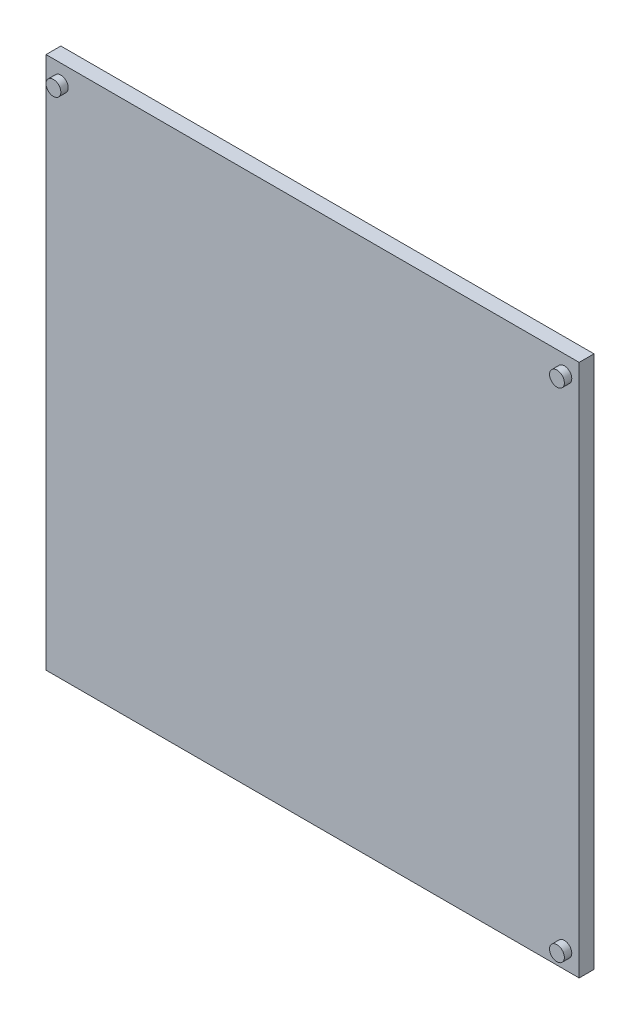
ISO-10303-21;
HEADER;
FILE_DESCRIPTION(('STEP AP214'),'2;1');
FILE_NAME('part.step','',(''),(''),'','','');
FILE_SCHEMA(('AUTOMOTIVE_DESIGN { 1 0 10303 214 1 1 1 1 }'));
ENDSEC;
DATA;
#1=APPLICATION_CONTEXT('core data for automotive mechanical design processes');
#2=APPLICATION_PROTOCOL_DEFINITION('international standard','automotive_design',2000,#1);
#3=PRODUCT_CONTEXT('',#1,'mechanical');
#4=PRODUCT('Part','Part','',(#3));
#5=PRODUCT_RELATED_PRODUCT_CATEGORY('part','',(#4));
#6=PRODUCT_DEFINITION_FORMATION('','',#4);
#7=PRODUCT_DEFINITION_CONTEXT('part definition',#1,'design');
#8=PRODUCT_DEFINITION('design','',#6,#7);
#9=PRODUCT_DEFINITION_SHAPE('','',#8);
#10=(LENGTH_UNIT() NAMED_UNIT(*) SI_UNIT(.MILLI.,.METRE.));
#11=(NAMED_UNIT(*) PLANE_ANGLE_UNIT() SI_UNIT($,.RADIAN.));
#12=(NAMED_UNIT(*) SI_UNIT($,.STERADIAN.) SOLID_ANGLE_UNIT());
#13=UNCERTAINTY_MEASURE_WITH_UNIT(LENGTH_MEASURE(1.E-05),#10,'distance_accuracy_value','');
#14=(GEOMETRIC_REPRESENTATION_CONTEXT(3) GLOBAL_UNCERTAINTY_ASSIGNED_CONTEXT((#13)) GLOBAL_UNIT_ASSIGNED_CONTEXT((#10,
#11,#12)) REPRESENTATION_CONTEXT('',''));
#15=CARTESIAN_POINT('',(0.,0.,0.));
#16=DIRECTION('',(0.,0.,1.));
#17=DIRECTION('',(1.,0.,0.));
#18=AXIS2_PLACEMENT_3D('',#15,#16,#17);
#19=CARTESIAN_POINT('',(45.,-45.,2.5));
#20=DIRECTION('',(-1.,0.,0.));
#21=DIRECTION('',(0.,0.,1.));
#22=AXIS2_PLACEMENT_3D('',#19,#20,#21);
#23=PLANE('',#22);
#24=DIRECTION('',(0.,1.,0.));
#25=VECTOR('',#24,1.);
#26=CARTESIAN_POINT('',(45.,-45.,0.));
#27=LINE('',#26,#25);
#28=CARTESIAN_POINT('',(45.,-45.,0.));
#29=VERTEX_POINT('',#28);
#30=CARTESIAN_POINT('',(45.,45.,0.));
#31=VERTEX_POINT('',#30);
#32=EDGE_CURVE('E112',#29,#31,#27,.T.);
#33=ORIENTED_EDGE('',*,*,#32,.T.);
#34=DIRECTION('',(0.,0.,-1.));
#35=VECTOR('',#34,1.);
#36=CARTESIAN_POINT('',(45.,45.,2.5));
#37=LINE('',#36,#35);
#38=CARTESIAN_POINT('',(45.,45.,2.5));
#39=VERTEX_POINT('',#38);
#40=EDGE_CURVE('E103',#39,#31,#37,.T.);
#41=ORIENTED_EDGE('',*,*,#40,.F.);
#42=DIRECTION('',(0.,1.,0.));
#43=VECTOR('',#42,1.);
#44=CARTESIAN_POINT('',(45.,-45.,2.5));
#45=LINE('',#44,#43);
#46=CARTESIAN_POINT('',(45.,-45.,2.5));
#47=VERTEX_POINT('',#46);
#48=EDGE_CURVE('E97',#47,#39,#45,.T.);
#49=ORIENTED_EDGE('',*,*,#48,.F.);
#50=DIRECTION('',(0.,0.,-1.));
#51=VECTOR('',#50,1.);
#52=CARTESIAN_POINT('',(45.,-45.,2.5));
#53=LINE('',#52,#51);
#54=EDGE_CURVE('E108',#47,#29,#53,.T.);
#55=ORIENTED_EDGE('',*,*,#54,.T.);
#56=EDGE_LOOP('',(#33,#41,#49,#55));
#57=FACE_BOUND('',#56,.T.);
#58=ADVANCED_FACE('F45',(#57),#23,.F.);
#59=CARTESIAN_POINT('',(-45.,45.,2.5));
#60=DIRECTION('',(0.,-1.,0.));
#61=DIRECTION('',(0.,0.,-1.));
#62=AXIS2_PLACEMENT_3D('',#59,#60,#61);
#63=PLANE('',#62);
#64=DIRECTION('',(-1.,0.,0.));
#65=VECTOR('',#64,1.);
#66=CARTESIAN_POINT('',(-45.,45.,0.));
#67=LINE('',#66,#65);
#68=CARTESIAN_POINT('',(-45.,45.,0.));
#69=VERTEX_POINT('',#68);
#70=EDGE_CURVE('E102',#31,#69,#67,.T.);
#71=ORIENTED_EDGE('',*,*,#70,.T.);
#72=DIRECTION('',(0.,0.,-1.));
#73=VECTOR('',#72,1.);
#74=CARTESIAN_POINT('',(-45.,45.,2.5));
#75=LINE('',#74,#73);
#76=CARTESIAN_POINT('',(-45.,45.,2.5));
#77=VERTEX_POINT('',#76);
#78=EDGE_CURVE('E100',#77,#69,#75,.T.);
#79=ORIENTED_EDGE('',*,*,#78,.F.);
#80=DIRECTION('',(-1.,0.,0.));
#81=VECTOR('',#80,1.);
#82=CARTESIAN_POINT('',(-45.,45.,2.5));
#83=LINE('',#82,#81);
#84=EDGE_CURVE('E92',#39,#77,#83,.T.);
#85=ORIENTED_EDGE('',*,*,#84,.F.);
#86=ORIENTED_EDGE('',*,*,#40,.T.);
#87=EDGE_LOOP('',(#71,#79,#85,#86));
#88=FACE_BOUND('',#87,.T.);
#89=ADVANCED_FACE('F101',(#88),#63,.F.);
#90=CARTESIAN_POINT('',(-45.,-45.,2.5));
#91=DIRECTION('',(1.,0.,0.));
#92=DIRECTION('',(0.,0.,-1.));
#93=AXIS2_PLACEMENT_3D('',#90,#91,#92);
#94=PLANE('',#93);
#95=DIRECTION('',(0.,-1.,0.));
#96=VECTOR('',#95,1.);
#97=CARTESIAN_POINT('',(-45.,-45.,0.));
#98=LINE('',#97,#96);
#99=CARTESIAN_POINT('',(-45.,-45.,0.));
#100=VERTEX_POINT('',#99);
#101=EDGE_CURVE('E78',#69,#100,#98,.T.);
#102=ORIENTED_EDGE('',*,*,#101,.T.);
#103=DIRECTION('',(0.,0.,-1.));
#104=VECTOR('',#103,1.);
#105=CARTESIAN_POINT('',(-45.,-45.,2.5));
#106=LINE('',#105,#104);
#107=CARTESIAN_POINT('',(-45.,-45.,2.5));
#108=VERTEX_POINT('',#107);
#109=EDGE_CURVE('E104',#108,#100,#106,.T.);
#110=ORIENTED_EDGE('',*,*,#109,.F.);
#111=DIRECTION('',(0.,-1.,0.));
#112=VECTOR('',#111,1.);
#113=CARTESIAN_POINT('',(-45.,-45.,2.5));
#114=LINE('',#113,#112);
#115=EDGE_CURVE('E95',#77,#108,#114,.T.);
#116=ORIENTED_EDGE('',*,*,#115,.F.);
#117=ORIENTED_EDGE('',*,*,#78,.T.);
#118=EDGE_LOOP('',(#102,#110,#116,#117));
#119=FACE_BOUND('',#118,.T.);
#120=ADVANCED_FACE('F106',(#119),#94,.F.);
#121=CARTESIAN_POINT('',(-45.,-45.,2.5));
#122=DIRECTION('',(0.,1.,0.));
#123=DIRECTION('',(0.,0.,1.));
#124=AXIS2_PLACEMENT_3D('',#121,#122,#123);
#125=PLANE('',#124);
#126=DIRECTION('',(1.,0.,0.));
#127=VECTOR('',#126,1.);
#128=CARTESIAN_POINT('',(-45.,-45.,0.));
#129=LINE('',#128,#127);
#130=EDGE_CURVE('E84',#100,#29,#129,.T.);
#131=ORIENTED_EDGE('',*,*,#130,.T.);
#132=ORIENTED_EDGE('',*,*,#54,.F.);
#133=DIRECTION('',(1.,0.,0.));
#134=VECTOR('',#133,1.);
#135=CARTESIAN_POINT('',(-45.,-45.,2.5));
#136=LINE('',#135,#134);
#137=EDGE_CURVE('E61',#108,#47,#136,.T.);
#138=ORIENTED_EDGE('',*,*,#137,.F.);
#139=ORIENTED_EDGE('',*,*,#109,.T.);
#140=EDGE_LOOP('',(#131,#132,#138,#139));
#141=FACE_BOUND('',#140,.T.);
#142=ADVANCED_FACE('F132',(#141),#125,.F.);
#143=CARTESIAN_POINT('',(0.,0.,2.5));
#144=DIRECTION('',(0.,0.,-1.));
#145=DIRECTION('',(-1.,0.,0.));
#146=AXIS2_PLACEMENT_3D('',#143,#144,#145);
#147=PLANE('',#146);
#148=CARTESIAN_POINT('',(-42.5,42.,2.5));
#149=DIRECTION('',(0.,0.,-1.));
#150=DIRECTION('',(-1.,0.,0.));
#151=AXIS2_PLACEMENT_3D('',#148,#149,#150);
#152=CIRCLE('',#151,1.25);
#153=CARTESIAN_POINT('',(-43.75,42.,2.5));
#154=VERTEX_POINT('',#153);
#155=EDGE_CURVE('E11',#154,#154,#152,.F.);
#156=ORIENTED_EDGE('',*,*,#155,.F.);
#157=EDGE_LOOP('',(#156));
#158=FACE_BOUND('',#157,.T.);
#159=CARTESIAN_POINT('',(42.5,42.,2.5));
#160=DIRECTION('',(0.,0.,-1.));
#161=DIRECTION('',(-1.,0.,0.));
#162=AXIS2_PLACEMENT_3D('',#159,#160,#161);
#163=CIRCLE('',#162,1.25);
#164=CARTESIAN_POINT('',(41.25,42.,2.5));
#165=VERTEX_POINT('',#164);
#166=EDGE_CURVE('E53',#165,#165,#163,.F.);
#167=ORIENTED_EDGE('',*,*,#166,.F.);
#168=EDGE_LOOP('',(#167));
#169=FACE_BOUND('',#168,.T.);
#170=CARTESIAN_POINT('',(42.5,-42.,2.5));
#171=DIRECTION('',(0.,0.,-1.));
#172=DIRECTION('',(-1.,0.,0.));
#173=AXIS2_PLACEMENT_3D('',#170,#171,#172);
#174=CIRCLE('',#173,1.25);
#175=CARTESIAN_POINT('',(41.25,-42.,2.5));
#176=VERTEX_POINT('',#175);
#177=EDGE_CURVE('E122',#176,#176,#174,.F.);
#178=ORIENTED_EDGE('',*,*,#177,.F.);
#179=EDGE_LOOP('',(#178));
#180=FACE_BOUND('',#179,.T.);
#181=ORIENTED_EDGE('',*,*,#48,.T.);
#182=ORIENTED_EDGE('',*,*,#84,.T.);
#183=ORIENTED_EDGE('',*,*,#115,.T.);
#184=ORIENTED_EDGE('',*,*,#137,.T.);
#185=EDGE_LOOP('',(#181,#182,#183,#184));
#186=FACE_BOUND('',#185,.T.);
#187=ADVANCED_FACE('F93',(#158,#169,#180,#186),#147,.F.);
#188=CARTESIAN_POINT('',(0.,0.,0.));
#189=DIRECTION('',(0.,0.,-1.));
#190=DIRECTION('',(-1.,0.,0.));
#191=AXIS2_PLACEMENT_3D('',#188,#189,#190);
#192=PLANE('',#191);
#193=ORIENTED_EDGE('',*,*,#32,.F.);
#194=ORIENTED_EDGE('',*,*,#130,.F.);
#195=ORIENTED_EDGE('',*,*,#101,.F.);
#196=ORIENTED_EDGE('',*,*,#70,.F.);
#197=EDGE_LOOP('',(#193,#194,#195,#196));
#198=FACE_BOUND('',#197,.T.);
#199=ADVANCED_FACE('F131',(#198),#192,.T.);
#200=CARTESIAN_POINT('',(42.5,-42.,3.75));
#201=DIRECTION('',(0.,0.,-1.));
#202=DIRECTION('',(-1.,0.,0.));
#203=AXIS2_PLACEMENT_3D('',#200,#201,#202);
#204=CYLINDRICAL_SURFACE('',#203,1.25);
#205=CARTESIAN_POINT('',(42.5,-42.,3.75));
#206=DIRECTION('',(0.,0.,1.));
#207=DIRECTION('',(1.,0.,0.));
#208=AXIS2_PLACEMENT_3D('',#205,#206,#207);
#209=CIRCLE('',#208,1.25);
#210=CARTESIAN_POINT('',(43.75,-42.,3.75));
#211=VERTEX_POINT('',#210);
#212=EDGE_CURVE('E247',#211,#211,#209,.T.);
#213=ORIENTED_EDGE('',*,*,#212,.F.);
#214=EDGE_LOOP('',(#213));
#215=FACE_BOUND('',#214,.T.);
#216=ORIENTED_EDGE('',*,*,#177,.T.);
#217=EDGE_LOOP('',(#216));
#218=FACE_BOUND('',#217,.T.);
#219=ADVANCED_FACE('F137',(#215,#218),#204,.T.);
#220=CARTESIAN_POINT('',(42.5,-42.,3.75));
#221=DIRECTION('',(0.,0.,1.));
#222=DIRECTION('',(1.,0.,0.));
#223=AXIS2_PLACEMENT_3D('',#220,#221,#222);
#224=PLANE('',#223);
#225=ORIENTED_EDGE('',*,*,#212,.T.);
#226=EDGE_LOOP('',(#225));
#227=FACE_BOUND('',#226,.T.);
#228=ADVANCED_FACE('F139',(#227),#224,.T.);
#229=CARTESIAN_POINT('',(42.5,42.,3.75));
#230=DIRECTION('',(0.,0.,-1.));
#231=DIRECTION('',(-1.,0.,0.));
#232=AXIS2_PLACEMENT_3D('',#229,#230,#231);
#233=CYLINDRICAL_SURFACE('',#232,1.25);
#234=CARTESIAN_POINT('',(42.5,42.,3.75));
#235=DIRECTION('',(0.,0.,1.));
#236=DIRECTION('',(-1.,0.,0.));
#237=AXIS2_PLACEMENT_3D('',#234,#235,#236);
#238=CIRCLE('',#237,1.25);
#239=CARTESIAN_POINT('',(41.25,42.,3.75));
#240=VERTEX_POINT('',#239);
#241=EDGE_CURVE('E244',#240,#240,#238,.T.);
#242=ORIENTED_EDGE('',*,*,#241,.F.);
#243=EDGE_LOOP('',(#242));
#244=FACE_BOUND('',#243,.T.);
#245=ORIENTED_EDGE('',*,*,#166,.T.);
#246=EDGE_LOOP('',(#245));
#247=FACE_BOUND('',#246,.T.);
#248=ADVANCED_FACE('F127',(#244,#247),#233,.T.);
#249=CARTESIAN_POINT('',(42.5,42.,3.75));
#250=DIRECTION('',(0.,0.,-1.));
#251=DIRECTION('',(-1.,0.,0.));
#252=AXIS2_PLACEMENT_3D('',#249,#250,#251);
#253=PLANE('',#252);
#254=ORIENTED_EDGE('',*,*,#241,.T.);
#255=EDGE_LOOP('',(#254));
#256=FACE_BOUND('',#255,.T.);
#257=ADVANCED_FACE('F208',(#256),#253,.F.);
#258=CARTESIAN_POINT('',(-42.5,42.,3.75));
#259=DIRECTION('',(0.,0.,-1.));
#260=DIRECTION('',(-1.,0.,0.));
#261=AXIS2_PLACEMENT_3D('',#258,#259,#260);
#262=CYLINDRICAL_SURFACE('',#261,1.25);
#263=CARTESIAN_POINT('',(-42.5,42.,3.75));
#264=DIRECTION('',(0.,0.,1.));
#265=DIRECTION('',(1.,0.,0.));
#266=AXIS2_PLACEMENT_3D('',#263,#264,#265);
#267=CIRCLE('',#266,1.25);
#268=CARTESIAN_POINT('',(-41.25,42.,3.75));
#269=VERTEX_POINT('',#268);
#270=EDGE_CURVE('E115',#269,#269,#267,.T.);
#271=ORIENTED_EDGE('',*,*,#270,.F.);
#272=EDGE_LOOP('',(#271));
#273=FACE_BOUND('',#272,.T.);
#274=ORIENTED_EDGE('',*,*,#155,.T.);
#275=EDGE_LOOP('',(#274));
#276=FACE_BOUND('',#275,.T.);
#277=ADVANCED_FACE('F217',(#273,#276),#262,.T.);
#278=CARTESIAN_POINT('',(-42.5,42.,3.75));
#279=DIRECTION('',(0.,0.,1.));
#280=DIRECTION('',(1.,0.,0.));
#281=AXIS2_PLACEMENT_3D('',#278,#279,#280);
#282=PLANE('',#281);
#283=ORIENTED_EDGE('',*,*,#270,.T.);
#284=EDGE_LOOP('',(#283));
#285=FACE_BOUND('',#284,.T.);
#286=ADVANCED_FACE('F225',(#285),#282,.T.);
#287=CLOSED_SHELL('',(#58,#89,#120,#142,#187,#199,#219,#228,#248,#257,#277,#286));
#288=MANIFOLD_SOLID_BREP('B2',#287);
#289=ADVANCED_BREP_SHAPE_REPRESENTATION('',(#18,#288),#14);
#290=SHAPE_DEFINITION_REPRESENTATION(#9,#289);
ENDSEC;
END-ISO-10303-21;
